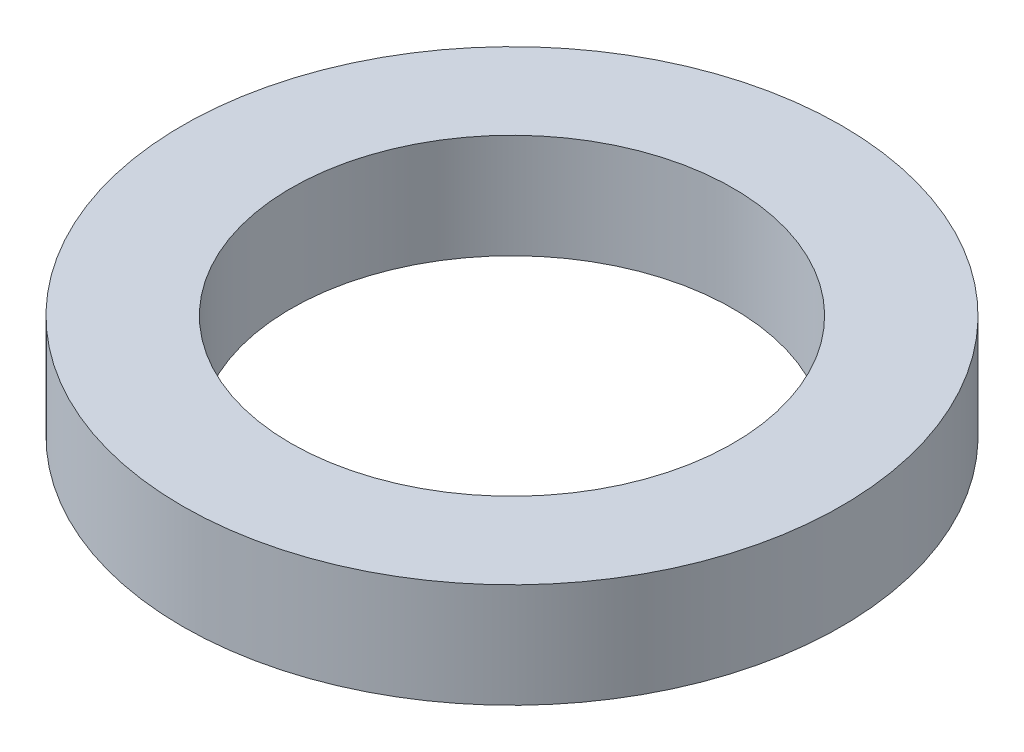
ISO-10303-21;
HEADER;
FILE_DESCRIPTION(('STEP AP214'),'2;1');
FILE_NAME('part.step','',(''),(''),'','','');
FILE_SCHEMA(('AUTOMOTIVE_DESIGN { 1 0 10303 214 1 1 1 1 }'));
ENDSEC;
DATA;
#1=APPLICATION_CONTEXT('core data for automotive mechanical design processes');
#2=APPLICATION_PROTOCOL_DEFINITION('international standard','automotive_design',2000,#1);
#3=PRODUCT_CONTEXT('',#1,'mechanical');
#4=PRODUCT('Part','Part','',(#3));
#5=PRODUCT_RELATED_PRODUCT_CATEGORY('part','',(#4));
#6=PRODUCT_DEFINITION_FORMATION('','',#4);
#7=PRODUCT_DEFINITION_CONTEXT('part definition',#1,'design');
#8=PRODUCT_DEFINITION('design','',#6,#7);
#9=PRODUCT_DEFINITION_SHAPE('','',#8);
#10=(LENGTH_UNIT() NAMED_UNIT(*) SI_UNIT(.MILLI.,.METRE.));
#11=(NAMED_UNIT(*) PLANE_ANGLE_UNIT() SI_UNIT($,.RADIAN.));
#12=(NAMED_UNIT(*) SI_UNIT($,.STERADIAN.) SOLID_ANGLE_UNIT());
#13=UNCERTAINTY_MEASURE_WITH_UNIT(LENGTH_MEASURE(1.E-05),#10,'distance_accuracy_value','');
#14=(GEOMETRIC_REPRESENTATION_CONTEXT(3) GLOBAL_UNCERTAINTY_ASSIGNED_CONTEXT((#13)) GLOBAL_UNIT_ASSIGNED_CONTEXT((#10,
#11,#12)) REPRESENTATION_CONTEXT('',''));
#15=CARTESIAN_POINT('',(0.,0.,0.));
#16=DIRECTION('',(0.,0.,1.));
#17=DIRECTION('',(1.,0.,0.));
#18=AXIS2_PLACEMENT_3D('',#15,#16,#17);
#19=CARTESIAN_POINT('',(0.,0.,0.));
#20=DIRECTION('',(0.,1.,0.));
#21=DIRECTION('',(0.,0.,1.));
#22=AXIS2_PLACEMENT_3D('',#19,#20,#21);
#23=CYLINDRICAL_SURFACE('',#22,4.025);
#24=CARTESIAN_POINT('',(0.,1.9,0.));
#25=DIRECTION('',(0.,1.,0.));
#26=DIRECTION('',(0.,0.,1.));
#27=AXIS2_PLACEMENT_3D('',#24,#25,#26);
#28=CIRCLE('',#27,4.025);
#29=CARTESIAN_POINT('',(0.,1.9,4.025));
#30=VERTEX_POINT('',#29);
#31=EDGE_CURVE('E10',#30,#30,#28,.T.);
#32=ORIENTED_EDGE('',*,*,#31,.T.);
#33=EDGE_LOOP('',(#32));
#34=FACE_BOUND('',#33,.T.);
#35=CARTESIAN_POINT('',(0.,0.,0.));
#36=DIRECTION('',(0.,1.,0.));
#37=DIRECTION('',(0.,0.,1.));
#38=AXIS2_PLACEMENT_3D('',#35,#36,#37);
#39=CIRCLE('',#38,4.025);
#40=CARTESIAN_POINT('',(0.,0.,4.025));
#41=VERTEX_POINT('',#40);
#42=EDGE_CURVE('E45',#41,#41,#39,.T.);
#43=ORIENTED_EDGE('',*,*,#42,.F.);
#44=EDGE_LOOP('',(#43));
#45=FACE_BOUND('',#44,.T.);
#46=ADVANCED_FACE('F31',(#34,#45),#23,.F.);
#47=CARTESIAN_POINT('',(4.025,1.9,0.));
#48=DIRECTION('',(0.,1.,0.));
#49=DIRECTION('',(0.,0.,1.));
#50=AXIS2_PLACEMENT_3D('',#47,#48,#49);
#51=PLANE('',#50);
#52=CARTESIAN_POINT('',(0.,1.9,0.));
#53=DIRECTION('',(0.,1.,0.));
#54=DIRECTION('',(0.,0.,1.));
#55=AXIS2_PLACEMENT_3D('',#52,#53,#54);
#56=CIRCLE('',#55,6.);
#57=CARTESIAN_POINT('',(0.,1.9,6.));
#58=VERTEX_POINT('',#57);
#59=EDGE_CURVE('E37',#58,#58,#56,.T.);
#60=ORIENTED_EDGE('',*,*,#59,.T.);
#61=EDGE_LOOP('',(#60));
#62=FACE_BOUND('',#61,.T.);
#63=ORIENTED_EDGE('',*,*,#31,.F.);
#64=EDGE_LOOP('',(#63));
#65=FACE_BOUND('',#64,.T.);
#66=ADVANCED_FACE('F55',(#62,#65),#51,.T.);
#67=CARTESIAN_POINT('',(0.,0.,0.));
#68=DIRECTION('',(0.,1.,0.));
#69=DIRECTION('',(0.,0.,1.));
#70=AXIS2_PLACEMENT_3D('',#67,#68,#69);
#71=CYLINDRICAL_SURFACE('',#70,6.);
#72=CARTESIAN_POINT('',(0.,0.,0.));
#73=DIRECTION('',(0.,1.,0.));
#74=DIRECTION('',(0.,0.,1.));
#75=AXIS2_PLACEMENT_3D('',#72,#73,#74);
#76=CIRCLE('',#75,6.);
#77=CARTESIAN_POINT('',(0.,0.,6.));
#78=VERTEX_POINT('',#77);
#79=EDGE_CURVE('E41',#78,#78,#76,.T.);
#80=ORIENTED_EDGE('',*,*,#79,.T.);
#81=EDGE_LOOP('',(#80));
#82=FACE_BOUND('',#81,.T.);
#83=ORIENTED_EDGE('',*,*,#59,.F.);
#84=EDGE_LOOP('',(#83));
#85=FACE_BOUND('',#84,.T.);
#86=ADVANCED_FACE('F59',(#82,#85),#71,.T.);
#87=CARTESIAN_POINT('',(6.,0.,0.));
#88=DIRECTION('',(0.,-1.,0.));
#89=DIRECTION('',(0.,0.,-1.));
#90=AXIS2_PLACEMENT_3D('',#87,#88,#89);
#91=PLANE('',#90);
#92=ORIENTED_EDGE('',*,*,#42,.T.);
#93=EDGE_LOOP('',(#92));
#94=FACE_BOUND('',#93,.T.);
#95=ORIENTED_EDGE('',*,*,#79,.F.);
#96=EDGE_LOOP('',(#95));
#97=FACE_BOUND('',#96,.T.);
#98=ADVANCED_FACE('F51',(#94,#97),#91,.T.);
#99=CLOSED_SHELL('',(#46,#66,#86,#98));
#100=MANIFOLD_SOLID_BREP('B2',#99);
#101=ADVANCED_BREP_SHAPE_REPRESENTATION('',(#18,#100),#14);
#102=SHAPE_DEFINITION_REPRESENTATION(#9,#101);
ENDSEC;
END-ISO-10303-21;
